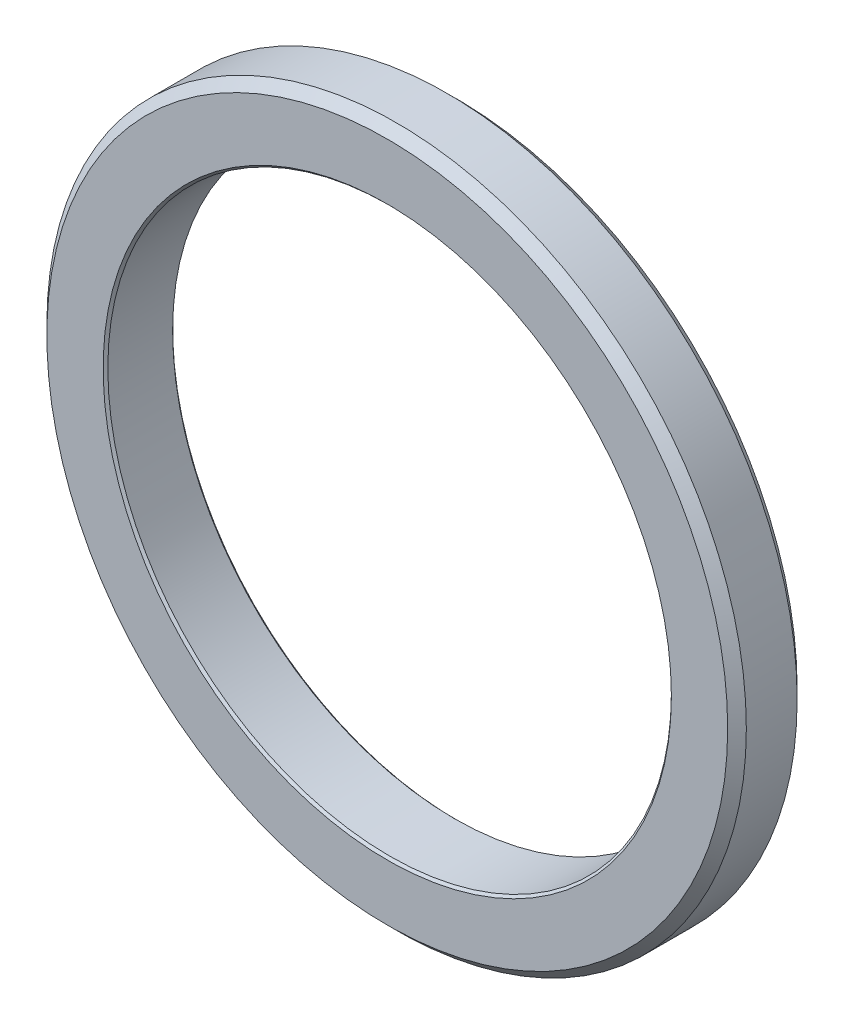
ISO-10303-21;
HEADER;
FILE_DESCRIPTION(('STEP AP214'),'2;1');
FILE_NAME('part.step','',(''),(''),'','','');
FILE_SCHEMA(('AUTOMOTIVE_DESIGN { 1 0 10303 214 1 1 1 1 }'));
ENDSEC;
DATA;
#1=APPLICATION_CONTEXT('core data for automotive mechanical design processes');
#2=APPLICATION_PROTOCOL_DEFINITION('international standard','automotive_design',2000,#1);
#3=PRODUCT_CONTEXT('',#1,'mechanical');
#4=PRODUCT('Part','Part','',(#3));
#5=PRODUCT_RELATED_PRODUCT_CATEGORY('part','',(#4));
#6=PRODUCT_DEFINITION_FORMATION('','',#4);
#7=PRODUCT_DEFINITION_CONTEXT('part definition',#1,'design');
#8=PRODUCT_DEFINITION('design','',#6,#7);
#9=PRODUCT_DEFINITION_SHAPE('','',#8);
#10=(LENGTH_UNIT() NAMED_UNIT(*) SI_UNIT(.MILLI.,.METRE.));
#11=(NAMED_UNIT(*) PLANE_ANGLE_UNIT() SI_UNIT($,.RADIAN.));
#12=(NAMED_UNIT(*) SI_UNIT($,.STERADIAN.) SOLID_ANGLE_UNIT());
#13=UNCERTAINTY_MEASURE_WITH_UNIT(LENGTH_MEASURE(1.E-05),#10,'distance_accuracy_value','');
#14=(GEOMETRIC_REPRESENTATION_CONTEXT(3) GLOBAL_UNCERTAINTY_ASSIGNED_CONTEXT((#13)) GLOBAL_UNIT_ASSIGNED_CONTEXT((#10,
#11,#12)) REPRESENTATION_CONTEXT('',''));
#15=CARTESIAN_POINT('',(0.,0.,0.));
#16=DIRECTION('',(0.,0.,1.));
#17=DIRECTION('',(1.,0.,0.));
#18=AXIS2_PLACEMENT_3D('',#15,#16,#17);
#19=CARTESIAN_POINT('',(0.,36.515,0.));
#20=DIRECTION('',(0.,0.,-1.));
#21=DIRECTION('',(-1.,0.,0.));
#22=AXIS2_PLACEMENT_3D('',#19,#20,#21);
#23=PLANE('',#22);
#24=CARTESIAN_POINT('',(0.,0.,0.));
#25=DIRECTION('',(0.,0.,1.));
#26=DIRECTION('',(1.,0.,0.));
#27=AXIS2_PLACEMENT_3D('',#24,#25,#26);
#28=CIRCLE('',#27,30.475);
#29=CARTESIAN_POINT('',(30.475,0.,0.));
#30=VERTEX_POINT('',#29);
#31=EDGE_CURVE('E10',#30,#30,#28,.T.);
#32=ORIENTED_EDGE('',*,*,#31,.F.);
#33=EDGE_LOOP('',(#32));
#34=FACE_BOUND('',#33,.T.);
#35=CARTESIAN_POINT('',(0.,0.,0.));
#36=DIRECTION('',(0.,0.,1.));
#37=DIRECTION('',(1.,0.,0.));
#38=AXIS2_PLACEMENT_3D('',#35,#36,#37);
#39=CIRCLE('',#38,36.515);
#40=CARTESIAN_POINT('',(36.515,0.,0.));
#41=VERTEX_POINT('',#40);
#42=EDGE_CURVE('E67',#41,#41,#39,.T.);
#43=ORIENTED_EDGE('',*,*,#42,.T.);
#44=EDGE_LOOP('',(#43));
#45=FACE_BOUND('',#44,.T.);
#46=ADVANCED_FACE('F39',(#34,#45),#23,.F.);
#47=CARTESIAN_POINT('',(0.,0.,0.));
#48=DIRECTION('',(0.,0.,1.));
#49=DIRECTION('',(1.,0.,0.));
#50=AXIS2_PLACEMENT_3D('',#47,#48,#49);
#51=CONICAL_SURFACE('',#50,30.475,0.785398163397449);
#52=CARTESIAN_POINT('',(0.,0.,-0.250000000000001));
#53=DIRECTION('',(0.,0.,1.));
#54=DIRECTION('',(1.,0.,0.));
#55=AXIS2_PLACEMENT_3D('',#52,#53,#54);
#56=CIRCLE('',#55,30.225);
#57=CARTESIAN_POINT('',(30.225,0.,-0.250000000000001));
#58=VERTEX_POINT('',#57);
#59=EDGE_CURVE('E45',#58,#58,#56,.T.);
#60=ORIENTED_EDGE('',*,*,#59,.F.);
#61=EDGE_LOOP('',(#60));
#62=FACE_BOUND('',#61,.T.);
#63=ORIENTED_EDGE('',*,*,#31,.T.);
#64=EDGE_LOOP('',(#63));
#65=FACE_BOUND('',#64,.T.);
#66=ADVANCED_FACE('F104',(#62,#65),#51,.F.);
#67=CARTESIAN_POINT('',(0.,0.,0.));
#68=DIRECTION('',(0.,0.,1.));
#69=DIRECTION('',(1.,0.,0.));
#70=AXIS2_PLACEMENT_3D('',#67,#68,#69);
#71=CYLINDRICAL_SURFACE('',#70,30.225);
#72=CARTESIAN_POINT('',(0.,0.,-7.2));
#73=DIRECTION('',(0.,0.,1.));
#74=DIRECTION('',(1.,0.,0.));
#75=AXIS2_PLACEMENT_3D('',#72,#73,#74);
#76=CIRCLE('',#75,30.225);
#77=CARTESIAN_POINT('',(30.225,0.,-7.2));
#78=VERTEX_POINT('',#77);
#79=EDGE_CURVE('E49',#78,#78,#76,.T.);
#80=ORIENTED_EDGE('',*,*,#79,.F.);
#81=EDGE_LOOP('',(#80));
#82=FACE_BOUND('',#81,.T.);
#83=ORIENTED_EDGE('',*,*,#59,.T.);
#84=EDGE_LOOP('',(#83));
#85=FACE_BOUND('',#84,.T.);
#86=ADVANCED_FACE('F99',(#82,#85),#71,.F.);
#87=CARTESIAN_POINT('',(0.,0.,-7.2));
#88=DIRECTION('',(0.,0.,-1.));
#89=DIRECTION('',(-1.,0.,0.));
#90=AXIS2_PLACEMENT_3D('',#87,#88,#89);
#91=CONICAL_SURFACE('',#90,30.225,0.785398163397448);
#92=CARTESIAN_POINT('',(0.,0.,-7.45));
#93=DIRECTION('',(0.,0.,1.));
#94=DIRECTION('',(1.,0.,0.));
#95=AXIS2_PLACEMENT_3D('',#92,#93,#94);
#96=CIRCLE('',#95,30.475);
#97=CARTESIAN_POINT('',(30.475,0.,-7.45));
#98=VERTEX_POINT('',#97);
#99=EDGE_CURVE('E53',#98,#98,#96,.T.);
#100=ORIENTED_EDGE('',*,*,#99,.F.);
#101=EDGE_LOOP('',(#100));
#102=FACE_BOUND('',#101,.T.);
#103=ORIENTED_EDGE('',*,*,#79,.T.);
#104=EDGE_LOOP('',(#103));
#105=FACE_BOUND('',#104,.T.);
#106=ADVANCED_FACE('F93',(#102,#105),#91,.F.);
#107=CARTESIAN_POINT('',(0.,36.515,-7.45));
#108=DIRECTION('',(0.,0.,1.));
#109=DIRECTION('',(1.,0.,0.));
#110=AXIS2_PLACEMENT_3D('',#107,#108,#109);
#111=PLANE('',#110);
#112=CARTESIAN_POINT('',(0.,0.,-7.45));
#113=DIRECTION('',(0.,0.,1.));
#114=DIRECTION('',(1.,0.,0.));
#115=AXIS2_PLACEMENT_3D('',#112,#113,#114);
#116=CIRCLE('',#115,36.515);
#117=CARTESIAN_POINT('',(36.515,0.,-7.45));
#118=VERTEX_POINT('',#117);
#119=EDGE_CURVE('E58',#118,#118,#116,.T.);
#120=ORIENTED_EDGE('',*,*,#119,.F.);
#121=EDGE_LOOP('',(#120));
#122=FACE_BOUND('',#121,.T.);
#123=ORIENTED_EDGE('',*,*,#99,.T.);
#124=EDGE_LOOP('',(#123));
#125=FACE_BOUND('',#124,.T.);
#126=ADVANCED_FACE('F87',(#122,#125),#111,.F.);
#127=CARTESIAN_POINT('',(0.,0.,-7.45));
#128=DIRECTION('',(0.,0.,1.));
#129=DIRECTION('',(1.,0.,0.));
#130=AXIS2_PLACEMENT_3D('',#127,#128,#129);
#131=CONICAL_SURFACE('',#130,36.515,0.785398163397448);
#132=CARTESIAN_POINT('',(0.,0.,-6.45));
#133=DIRECTION('',(0.,0.,1.));
#134=DIRECTION('',(1.,0.,0.));
#135=AXIS2_PLACEMENT_3D('',#132,#133,#134);
#136=CIRCLE('',#135,37.515);
#137=CARTESIAN_POINT('',(37.515,0.,-6.45));
#138=VERTEX_POINT('',#137);
#139=EDGE_CURVE('E61',#138,#138,#136,.T.);
#140=ORIENTED_EDGE('',*,*,#139,.F.);
#141=EDGE_LOOP('',(#140));
#142=FACE_BOUND('',#141,.T.);
#143=ORIENTED_EDGE('',*,*,#119,.T.);
#144=EDGE_LOOP('',(#143));
#145=FACE_BOUND('',#144,.T.);
#146=ADVANCED_FACE('F81',(#142,#145),#131,.T.);
#147=CARTESIAN_POINT('',(0.,0.,0.));
#148=DIRECTION('',(0.,0.,1.));
#149=DIRECTION('',(1.,0.,0.));
#150=AXIS2_PLACEMENT_3D('',#147,#148,#149);
#151=CYLINDRICAL_SURFACE('',#150,37.515);
#152=CARTESIAN_POINT('',(0.,0.,-1.));
#153=DIRECTION('',(0.,0.,1.));
#154=DIRECTION('',(1.,0.,0.));
#155=AXIS2_PLACEMENT_3D('',#152,#153,#154);
#156=CIRCLE('',#155,37.515);
#157=CARTESIAN_POINT('',(37.515,0.,-1.));
#158=VERTEX_POINT('',#157);
#159=EDGE_CURVE('E64',#158,#158,#156,.T.);
#160=ORIENTED_EDGE('',*,*,#159,.F.);
#161=EDGE_LOOP('',(#160));
#162=FACE_BOUND('',#161,.T.);
#163=ORIENTED_EDGE('',*,*,#139,.T.);
#164=EDGE_LOOP('',(#163));
#165=FACE_BOUND('',#164,.T.);
#166=ADVANCED_FACE('F75',(#162,#165),#151,.T.);
#167=CARTESIAN_POINT('',(0.,0.,-1.));
#168=DIRECTION('',(0.,0.,-1.));
#169=DIRECTION('',(-1.,0.,0.));
#170=AXIS2_PLACEMENT_3D('',#167,#168,#169);
#171=CONICAL_SURFACE('',#170,37.515,0.785398163397449);
#172=ORIENTED_EDGE('',*,*,#42,.F.);
#173=EDGE_LOOP('',(#172));
#174=FACE_BOUND('',#173,.T.);
#175=ORIENTED_EDGE('',*,*,#159,.T.);
#176=EDGE_LOOP('',(#175));
#177=FACE_BOUND('',#176,.T.);
#178=ADVANCED_FACE('F72',(#174,#177),#171,.T.);
#179=CLOSED_SHELL('',(#46,#66,#86,#106,#126,#146,#166,#178));
#180=MANIFOLD_SOLID_BREP('B2',#179);
#181=ADVANCED_BREP_SHAPE_REPRESENTATION('',(#18,#180),#14);
#182=SHAPE_DEFINITION_REPRESENTATION(#9,#181);
ENDSEC;
END-ISO-10303-21;
